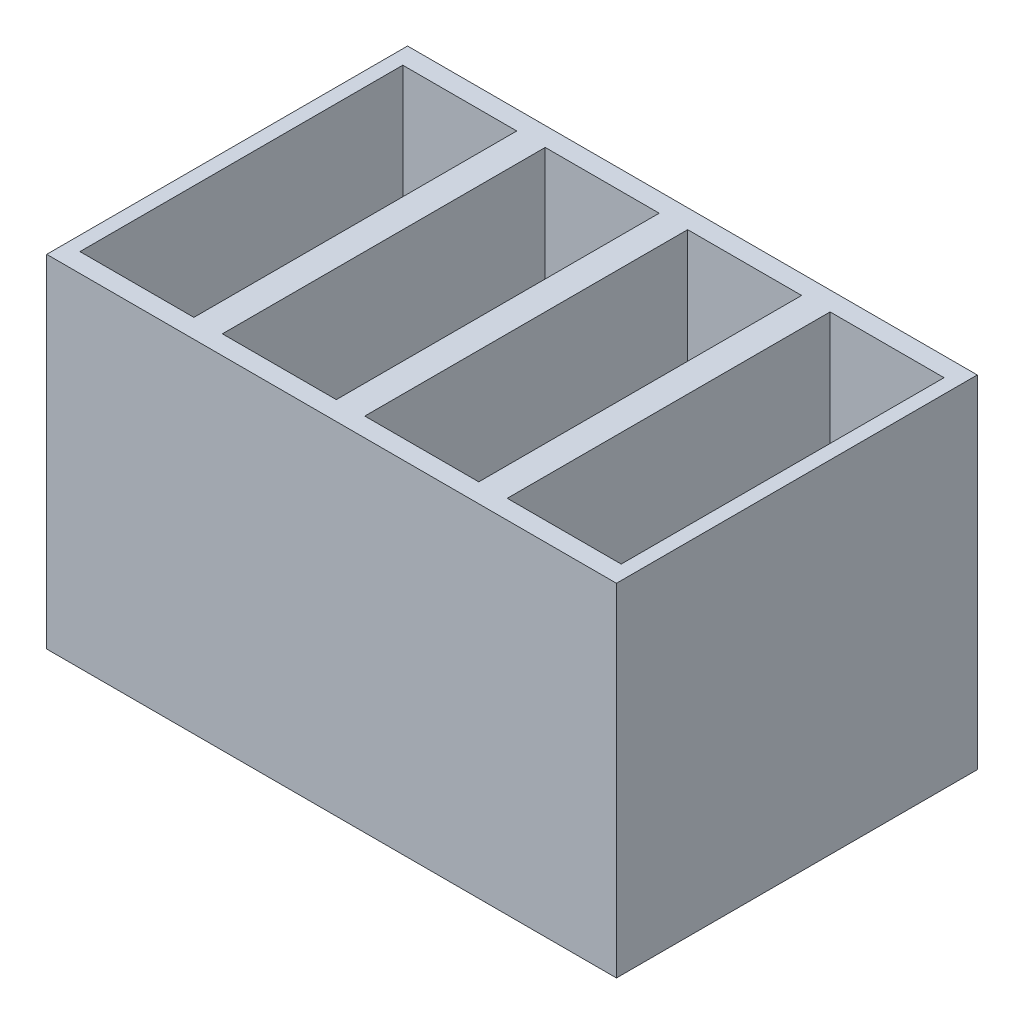
ISO-10303-21;
HEADER;
FILE_DESCRIPTION(('STEP AP214'),'2;1');
FILE_NAME('part.step','',(''),(''),'','','');
FILE_SCHEMA(('AUTOMOTIVE_DESIGN { 1 0 10303 214 1 1 1 1 }'));
ENDSEC;
DATA;
#1=APPLICATION_CONTEXT('core data for automotive mechanical design processes');
#2=APPLICATION_PROTOCOL_DEFINITION('international standard','automotive_design',2000,#1);
#3=PRODUCT_CONTEXT('',#1,'mechanical');
#4=PRODUCT('Part','Part','',(#3));
#5=PRODUCT_RELATED_PRODUCT_CATEGORY('part','',(#4));
#6=PRODUCT_DEFINITION_FORMATION('','',#4);
#7=PRODUCT_DEFINITION_CONTEXT('part definition',#1,'design');
#8=PRODUCT_DEFINITION('design','',#6,#7);
#9=PRODUCT_DEFINITION_SHAPE('','',#8);
#10=(LENGTH_UNIT() NAMED_UNIT(*) SI_UNIT(.MILLI.,.METRE.));
#11=(NAMED_UNIT(*) PLANE_ANGLE_UNIT() SI_UNIT($,.RADIAN.));
#12=(NAMED_UNIT(*) SI_UNIT($,.STERADIAN.) SOLID_ANGLE_UNIT());
#13=UNCERTAINTY_MEASURE_WITH_UNIT(LENGTH_MEASURE(1.E-05),#10,'distance_accuracy_value','');
#14=(GEOMETRIC_REPRESENTATION_CONTEXT(3) GLOBAL_UNCERTAINTY_ASSIGNED_CONTEXT((#13)) GLOBAL_UNIT_ASSIGNED_CONTEXT((#10,
#11,#12)) REPRESENTATION_CONTEXT('',''));
#15=CARTESIAN_POINT('',(0.,0.,0.));
#16=DIRECTION('',(0.,0.,1.));
#17=DIRECTION('',(1.,0.,0.));
#18=AXIS2_PLACEMENT_3D('',#15,#16,#17);
#19=CARTESIAN_POINT('',(0.,914.4,0.));
#20=DIRECTION('',(0.,1.,0.));
#21=DIRECTION('',(0.,0.,0.999999999999999));
#22=AXIS2_PLACEMENT_3D('',#19,#20,#21);
#23=PLANE('',#22);
#24=DIRECTION('',(0.,0.,0.999999999999999));
#25=VECTOR('',#24,1.);
#26=CARTESIAN_POINT('',(-1828.8,914.4,-482.600000000002));
#27=LINE('',#26,#25);
#28=CARTESIAN_POINT('',(-1828.8,914.4,-482.600000000002));
#29=VERTEX_POINT('',#28);
#30=CARTESIAN_POINT('',(-1828.8,914.4,482.599999999998));
#31=VERTEX_POINT('',#30);
#32=EDGE_CURVE('E350',#29,#31,#27,.T.);
#33=ORIENTED_EDGE('',*,*,#32,.T.);
#34=DIRECTION('',(1.,0.,0.));
#35=VECTOR('',#34,1.);
#36=CARTESIAN_POINT('',(-1828.8,914.4,482.599999999998));
#37=LINE('',#36,#35);
#38=CARTESIAN_POINT('',(-304.8,914.4,482.599999999998));
#39=VERTEX_POINT('',#38);
#40=EDGE_CURVE('E354',#31,#39,#37,.T.);
#41=ORIENTED_EDGE('',*,*,#40,.T.);
#42=DIRECTION('',(0.,0.,-0.999999999999999));
#43=VECTOR('',#42,1.);
#44=CARTESIAN_POINT('',(-304.8,914.4,-482.600000000002));
#45=LINE('',#44,#43);
#46=CARTESIAN_POINT('',(-304.8,914.4,-482.600000000002));
#47=VERTEX_POINT('',#46);
#48=EDGE_CURVE('E358',#39,#47,#45,.T.);
#49=ORIENTED_EDGE('',*,*,#48,.T.);
#50=DIRECTION('',(-1.,0.,0.));
#51=VECTOR('',#50,1.);
#52=CARTESIAN_POINT('',(-1828.8,914.4,-482.600000000002));
#53=LINE('',#52,#51);
#54=EDGE_CURVE('E361',#47,#29,#53,.T.);
#55=ORIENTED_EDGE('',*,*,#54,.T.);
#56=EDGE_LOOP('',(#33,#41,#49,#55));
#57=FACE_BOUND('',#56,.T.);
#58=DIRECTION('',(1.,0.,0.));
#59=VECTOR('',#58,1.);
#60=CARTESIAN_POINT('',(-1790.7,914.4,431.799999999999));
#61=LINE('',#60,#59);
#62=CARTESIAN_POINT('',(-1790.7,914.4,431.799999999999));
#63=VERTEX_POINT('',#62);
#64=CARTESIAN_POINT('',(-1485.9,914.4,431.799999999999));
#65=VERTEX_POINT('',#64);
#66=EDGE_CURVE('E310',#63,#65,#61,.T.);
#67=ORIENTED_EDGE('',*,*,#66,.F.);
#68=DIRECTION('',(0.,0.,0.999999999999999));
#69=VECTOR('',#68,1.);
#70=CARTESIAN_POINT('',(-1790.7,914.4,-431.799999999999));
#71=LINE('',#70,#69);
#72=CARTESIAN_POINT('',(-1790.7,914.4,-431.799999999999));
#73=VERTEX_POINT('',#72);
#74=EDGE_CURVE('E307',#73,#63,#71,.T.);
#75=ORIENTED_EDGE('',*,*,#74,.F.);
#76=DIRECTION('',(-1.,0.,0.));
#77=VECTOR('',#76,1.);
#78=CARTESIAN_POINT('',(-1790.7,914.4,-431.799999999999));
#79=LINE('',#78,#77);
#80=CARTESIAN_POINT('',(-1485.9,914.4,-431.799999999999));
#81=VERTEX_POINT('',#80);
#82=EDGE_CURVE('E318',#81,#73,#79,.T.);
#83=ORIENTED_EDGE('',*,*,#82,.F.);
#84=DIRECTION('',(0.,0.,-0.999999999999999));
#85=VECTOR('',#84,1.);
#86=CARTESIAN_POINT('',(-1485.9,914.4,-431.799999999999));
#87=LINE('',#86,#85);
#88=EDGE_CURVE('E314',#65,#81,#87,.T.);
#89=ORIENTED_EDGE('',*,*,#88,.F.);
#90=EDGE_LOOP('',(#67,#75,#83,#89));
#91=FACE_BOUND('',#90,.T.);
#92=DIRECTION('',(0.,0.,0.999999999999999));
#93=VECTOR('',#92,1.);
#94=CARTESIAN_POINT('',(-1409.7,914.4,-431.799999999999));
#95=LINE('',#94,#93);
#96=CARTESIAN_POINT('',(-1409.7,914.4,-431.799999999999));
#97=VERTEX_POINT('',#96);
#98=CARTESIAN_POINT('',(-1409.7,914.4,431.799999999999));
#99=VERTEX_POINT('',#98);
#100=EDGE_CURVE('E267',#97,#99,#95,.T.);
#101=ORIENTED_EDGE('',*,*,#100,.F.);
#102=DIRECTION('',(-1.,0.,0.));
#103=VECTOR('',#102,1.);
#104=CARTESIAN_POINT('',(-1409.7,914.4,-431.799999999999));
#105=LINE('',#104,#103);
#106=CARTESIAN_POINT('',(-1104.9,914.4,-431.799999999999));
#107=VERTEX_POINT('',#106);
#108=EDGE_CURVE('E264',#107,#97,#105,.T.);
#109=ORIENTED_EDGE('',*,*,#108,.F.);
#110=DIRECTION('',(0.,0.,-0.999999999999999));
#111=VECTOR('',#110,1.);
#112=CARTESIAN_POINT('',(-1104.9,914.4,-431.799999999999));
#113=LINE('',#112,#111);
#114=CARTESIAN_POINT('',(-1104.9,914.4,431.799999999999));
#115=VERTEX_POINT('',#114);
#116=EDGE_CURVE('E275',#115,#107,#113,.T.);
#117=ORIENTED_EDGE('',*,*,#116,.F.);
#118=DIRECTION('',(1.,0.,0.));
#119=VECTOR('',#118,1.);
#120=CARTESIAN_POINT('',(-1409.7,914.4,431.799999999999));
#121=LINE('',#120,#119);
#122=EDGE_CURVE('E271',#99,#115,#121,.T.);
#123=ORIENTED_EDGE('',*,*,#122,.F.);
#124=EDGE_LOOP('',(#101,#109,#117,#123));
#125=FACE_BOUND('',#124,.T.);
#126=DIRECTION('',(0.,0.,0.999999999999999));
#127=VECTOR('',#126,1.);
#128=CARTESIAN_POINT('',(-1028.7,914.4,-431.799999999999));
#129=LINE('',#128,#127);
#130=CARTESIAN_POINT('',(-1028.7,914.4,-431.799999999999));
#131=VERTEX_POINT('',#130);
#132=CARTESIAN_POINT('',(-1028.7,914.4,431.799999999999));
#133=VERTEX_POINT('',#132);
#134=EDGE_CURVE('E224',#131,#133,#129,.T.);
#135=ORIENTED_EDGE('',*,*,#134,.F.);
#136=DIRECTION('',(-1.,0.,0.));
#137=VECTOR('',#136,1.);
#138=CARTESIAN_POINT('',(-1028.7,914.4,-431.799999999999));
#139=LINE('',#138,#137);
#140=CARTESIAN_POINT('',(-723.9,914.4,-431.799999999999));
#141=VERTEX_POINT('',#140);
#142=EDGE_CURVE('E221',#141,#131,#139,.T.);
#143=ORIENTED_EDGE('',*,*,#142,.F.);
#144=DIRECTION('',(0.,0.,-0.999999999999999));
#145=VECTOR('',#144,1.);
#146=CARTESIAN_POINT('',(-723.9,914.4,-431.799999999999));
#147=LINE('',#146,#145);
#148=CARTESIAN_POINT('',(-723.9,914.4,431.799999999999));
#149=VERTEX_POINT('',#148);
#150=EDGE_CURVE('E232',#149,#141,#147,.T.);
#151=ORIENTED_EDGE('',*,*,#150,.F.);
#152=DIRECTION('',(1.,0.,0.));
#153=VECTOR('',#152,1.);
#154=CARTESIAN_POINT('',(-1028.7,914.4,431.799999999999));
#155=LINE('',#154,#153);
#156=EDGE_CURVE('E228',#133,#149,#155,.T.);
#157=ORIENTED_EDGE('',*,*,#156,.F.);
#158=EDGE_LOOP('',(#135,#143,#151,#157));
#159=FACE_BOUND('',#158,.T.);
#160=DIRECTION('',(0.,0.,0.999999999999999));
#161=VECTOR('',#160,1.);
#162=CARTESIAN_POINT('',(-647.7,914.4,-431.799999999999));
#163=LINE('',#162,#161);
#164=CARTESIAN_POINT('',(-647.7,914.4,-431.799999999999));
#165=VERTEX_POINT('',#164);
#166=CARTESIAN_POINT('',(-647.7,914.4,431.799999999999));
#167=VERTEX_POINT('',#166);
#168=EDGE_CURVE('E181',#165,#167,#163,.T.);
#169=ORIENTED_EDGE('',*,*,#168,.F.);
#170=DIRECTION('',(-1.,0.,0.));
#171=VECTOR('',#170,1.);
#172=CARTESIAN_POINT('',(-647.7,914.4,-431.799999999999));
#173=LINE('',#172,#171);
#174=CARTESIAN_POINT('',(-342.9,914.4,-431.799999999999));
#175=VERTEX_POINT('',#174);
#176=EDGE_CURVE('E172',#175,#165,#173,.T.);
#177=ORIENTED_EDGE('',*,*,#176,.F.);
#178=DIRECTION('',(0.,0.,-0.999999999999999));
#179=VECTOR('',#178,1.);
#180=CARTESIAN_POINT('',(-342.9,914.4,-431.799999999999));
#181=LINE('',#180,#179);
#182=CARTESIAN_POINT('',(-342.9,914.4,431.799999999999));
#183=VERTEX_POINT('',#182);
#184=EDGE_CURVE('E199',#183,#175,#181,.T.);
#185=ORIENTED_EDGE('',*,*,#184,.F.);
#186=DIRECTION('',(1.,0.,0.));
#187=VECTOR('',#186,1.);
#188=CARTESIAN_POINT('',(-647.7,914.4,431.799999999999));
#189=LINE('',#188,#187);
#190=EDGE_CURVE('E194',#167,#183,#189,.T.);
#191=ORIENTED_EDGE('',*,*,#190,.F.);
#192=EDGE_LOOP('',(#169,#177,#185,#191));
#193=FACE_BOUND('',#192,.T.);
#194=ADVANCED_FACE('F34',(#57,#91,#125,#159,#193),#23,.T.);
#195=CARTESIAN_POINT('',(0.,0.,0.));
#196=DIRECTION('',(0.,1.,0.));
#197=DIRECTION('',(0.,0.,0.999999999999999));
#198=AXIS2_PLACEMENT_3D('',#195,#196,#197);
#199=PLANE('',#198);
#200=DIRECTION('',(-1.,0.,0.));
#201=VECTOR('',#200,1.);
#202=CARTESIAN_POINT('',(-1028.7,2.11626714000298E-13,-431.799999999999));
#203=LINE('',#202,#201);
#204=CARTESIAN_POINT('',(-723.9,2.0611685626562E-13,-431.799999999999));
#205=VERTEX_POINT('',#204);
#206=CARTESIAN_POINT('',(-1028.7,2.11626714000298E-13,-431.799999999999));
#207=VERTEX_POINT('',#206);
#208=EDGE_CURVE('E190',#205,#207,#203,.T.);
#209=ORIENTED_EDGE('',*,*,#208,.T.);
#210=DIRECTION('',(0.,0.,0.999999999999999));
#211=VECTOR('',#210,1.);
#212=CARTESIAN_POINT('',(-1028.7,2.11626714000298E-13,-431.799999999999));
#213=LINE('',#212,#211);
#214=CARTESIAN_POINT('',(-1028.7,-1.74435174291221E-13,431.799999999999));
#215=VERTEX_POINT('',#214);
#216=EDGE_CURVE('E239',#207,#215,#213,.T.);
#217=ORIENTED_EDGE('',*,*,#216,.T.);
#218=DIRECTION('',(1.,0.,0.));
#219=VECTOR('',#218,1.);
#220=CARTESIAN_POINT('',(-1028.7,-1.74435174291221E-13,431.799999999999));
#221=LINE('',#220,#219);
#222=CARTESIAN_POINT('',(-723.9,-1.79945032025899E-13,431.799999999999));
#223=VERTEX_POINT('',#222);
#224=EDGE_CURVE('E243',#215,#223,#221,.T.);
#225=ORIENTED_EDGE('',*,*,#224,.T.);
#226=DIRECTION('',(0.,0.,-0.999999999999999));
#227=VECTOR('',#226,1.);
#228=CARTESIAN_POINT('',(-723.9,2.0611685626562E-13,-431.799999999999));
#229=LINE('',#228,#227);
#230=EDGE_CURVE('E225',#223,#205,#229,.T.);
#231=ORIENTED_EDGE('',*,*,#230,.T.);
#232=EDGE_LOOP('',(#209,#217,#225,#231));
#233=FACE_BOUND('',#232,.T.);
#234=DIRECTION('',(0.,0.,0.999999999999999));
#235=VECTOR('',#234,1.);
#236=CARTESIAN_POINT('',(-1790.7,2.25401358336993E-13,-431.799999999999));
#237=LINE('',#236,#235);
#238=CARTESIAN_POINT('',(-1790.7,2.25401358336993E-13,-431.799999999999));
#239=VERTEX_POINT('',#238);
#240=CARTESIAN_POINT('',(-1790.7,-1.60660529954526E-13,431.799999999999));
#241=VERTEX_POINT('',#240);
#242=EDGE_CURVE('E306',#239,#241,#237,.T.);
#243=ORIENTED_EDGE('',*,*,#242,.T.);
#244=DIRECTION('',(1.,0.,0.));
#245=VECTOR('',#244,1.);
#246=CARTESIAN_POINT('',(-1790.7,-1.60660529954526E-13,431.799999999999));
#247=LINE('',#246,#245);
#248=CARTESIAN_POINT('',(-1485.9,-1.66170387689204E-13,431.799999999999));
#249=VERTEX_POINT('',#248);
#250=EDGE_CURVE('E325',#241,#249,#247,.T.);
#251=ORIENTED_EDGE('',*,*,#250,.T.);
#252=DIRECTION('',(0.,0.,-0.999999999999999));
#253=VECTOR('',#252,1.);
#254=CARTESIAN_POINT('',(-1485.9,2.19891500602315E-13,-431.799999999999));
#255=LINE('',#254,#253);
#256=CARTESIAN_POINT('',(-1485.9,2.19891500602315E-13,-431.799999999999));
#257=VERTEX_POINT('',#256);
#258=EDGE_CURVE('E329',#249,#257,#255,.T.);
#259=ORIENTED_EDGE('',*,*,#258,.T.);
#260=DIRECTION('',(-1.,0.,0.));
#261=VECTOR('',#260,1.);
#262=CARTESIAN_POINT('',(-1790.7,2.25401358336993E-13,-431.799999999999));
#263=LINE('',#262,#261);
#264=EDGE_CURVE('E311',#257,#239,#263,.T.);
#265=ORIENTED_EDGE('',*,*,#264,.T.);
#266=EDGE_LOOP('',(#243,#251,#259,#265));
#267=FACE_BOUND('',#266,.T.);
#268=DIRECTION('',(0.,0.,0.999999999999999));
#269=VECTOR('',#268,1.);
#270=CARTESIAN_POINT('',(-1828.8,2.48799613394506E-13,-482.600000000002));
#271=LINE('',#270,#269);
#272=CARTESIAN_POINT('',(-1828.8,2.48799613394506E-13,-482.600000000002));
#273=VERTEX_POINT('',#272);
#274=CARTESIAN_POINT('',(-1828.8,-1.8268132057837E-13,482.600000000002));
#275=VERTEX_POINT('',#274);
#276=EDGE_CURVE('E349',#273,#275,#271,.T.);
#277=ORIENTED_EDGE('',*,*,#276,.F.);
#278=DIRECTION('',(-1.,0.,0.));
#279=VECTOR('',#278,1.);
#280=CARTESIAN_POINT('',(-1828.8,2.48799613394506E-13,-482.600000000002));
#281=LINE('',#280,#279);
#282=CARTESIAN_POINT('',(-304.8,2.21250324721116E-13,-482.600000000002));
#283=VERTEX_POINT('',#282);
#284=EDGE_CURVE('E355',#283,#273,#281,.T.);
#285=ORIENTED_EDGE('',*,*,#284,.F.);
#286=DIRECTION('',(0.,0.,-0.999999999999999));
#287=VECTOR('',#286,1.);
#288=CARTESIAN_POINT('',(-304.8,2.21250324721116E-13,-482.600000000002));
#289=LINE('',#288,#287);
#290=CARTESIAN_POINT('',(-304.8,-2.10230609251759E-13,482.599999999998));
#291=VERTEX_POINT('',#290);
#292=EDGE_CURVE('E371',#291,#283,#289,.T.);
#293=ORIENTED_EDGE('',*,*,#292,.F.);
#294=DIRECTION('',(1.,0.,0.));
#295=VECTOR('',#294,1.);
#296=CARTESIAN_POINT('',(-1828.8,-1.8268132057837E-13,482.600000000002));
#297=LINE('',#296,#295);
#298=EDGE_CURVE('E368',#275,#291,#297,.T.);
#299=ORIENTED_EDGE('',*,*,#298,.F.);
#300=EDGE_LOOP('',(#277,#285,#293,#299));
#301=FACE_BOUND('',#300,.T.);
#302=DIRECTION('',(-1.,0.,0.));
#303=VECTOR('',#302,1.);
#304=CARTESIAN_POINT('',(-1409.7,2.18514036168645E-13,-431.799999999999));
#305=LINE('',#304,#303);
#306=CARTESIAN_POINT('',(-1104.9,2.13004178433967E-13,-431.799999999999));
#307=VERTEX_POINT('',#306);
#308=CARTESIAN_POINT('',(-1409.7,2.18514036168645E-13,-431.799999999999));
#309=VERTEX_POINT('',#308);
#310=EDGE_CURVE('E263',#307,#309,#305,.T.);
#311=ORIENTED_EDGE('',*,*,#310,.T.);
#312=DIRECTION('',(0.,0.,0.999999999999999));
#313=VECTOR('',#312,1.);
#314=CARTESIAN_POINT('',(-1409.7,2.18514036168645E-13,-431.799999999999));
#315=LINE('',#314,#313);
#316=CARTESIAN_POINT('',(-1409.7,-1.67547852122874E-13,431.799999999999));
#317=VERTEX_POINT('',#316);
#318=EDGE_CURVE('E282',#309,#317,#315,.T.);
#319=ORIENTED_EDGE('',*,*,#318,.T.);
#320=DIRECTION('',(1.,0.,0.));
#321=VECTOR('',#320,1.);
#322=CARTESIAN_POINT('',(-1409.7,-1.67547852122874E-13,431.799999999999));
#323=LINE('',#322,#321);
#324=CARTESIAN_POINT('',(-1104.9,-1.73057709857552E-13,431.799999999999));
#325=VERTEX_POINT('',#324);
#326=EDGE_CURVE('E286',#317,#325,#323,.T.);
#327=ORIENTED_EDGE('',*,*,#326,.T.);
#328=DIRECTION('',(0.,0.,-0.999999999999999));
#329=VECTOR('',#328,1.);
#330=CARTESIAN_POINT('',(-1104.9,2.13004178433967E-13,-431.799999999999));
#331=LINE('',#330,#329);
#332=EDGE_CURVE('E268',#325,#307,#331,.T.);
#333=ORIENTED_EDGE('',*,*,#332,.T.);
#334=EDGE_LOOP('',(#311,#319,#327,#333));
#335=FACE_BOUND('',#334,.T.);
#336=DIRECTION('',(-1.,0.,0.));
#337=VECTOR('',#336,1.);
#338=CARTESIAN_POINT('',(-647.7,2.0473939183195E-13,-431.799999999999));
#339=LINE('',#338,#337);
#340=CARTESIAN_POINT('',(-342.9,1.99229534097273E-13,-431.799999999999));
#341=VERTEX_POINT('',#340);
#342=CARTESIAN_POINT('',(-647.7,2.0473939183195E-13,-431.799999999999));
#343=VERTEX_POINT('',#342);
#344=EDGE_CURVE('E58',#341,#343,#339,.T.);
#345=ORIENTED_EDGE('',*,*,#344,.T.);
#346=DIRECTION('',(0.,0.,0.999999999999999));
#347=VECTOR('',#346,1.);
#348=CARTESIAN_POINT('',(-647.7,2.0473939183195E-13,-431.799999999999));
#349=LINE('',#348,#347);
#350=CARTESIAN_POINT('',(-647.7,-1.81322496459569E-13,431.799999999999));
#351=VERTEX_POINT('',#350);
#352=EDGE_CURVE('E188',#343,#351,#349,.T.);
#353=ORIENTED_EDGE('',*,*,#352,.T.);
#354=DIRECTION('',(1.,0.,0.));
#355=VECTOR('',#354,1.);
#356=CARTESIAN_POINT('',(-647.7,-1.81322496459569E-13,431.799999999999));
#357=LINE('',#356,#355);
#358=CARTESIAN_POINT('',(-342.9,-1.86832354194247E-13,431.799999999999));
#359=VERTEX_POINT('',#358);
#360=EDGE_CURVE('E208',#351,#359,#357,.T.);
#361=ORIENTED_EDGE('',*,*,#360,.T.);
#362=DIRECTION('',(0.,0.,-0.999999999999999));
#363=VECTOR('',#362,1.);
#364=CARTESIAN_POINT('',(-342.9,1.99229534097273E-13,-431.799999999999));
#365=LINE('',#364,#363);
#366=EDGE_CURVE('E182',#359,#341,#365,.T.);
#367=ORIENTED_EDGE('',*,*,#366,.T.);
#368=EDGE_LOOP('',(#345,#353,#361,#367));
#369=FACE_BOUND('',#368,.T.);
#370=ADVANCED_FACE('F395',(#233,#267,#301,#335,#369),#199,.F.);
#371=CARTESIAN_POINT('',(-1828.8,914.4,-482.600000000002));
#372=DIRECTION('',(1.,0.,0.));
#373=DIRECTION('',(0.,0.,-0.999999999999999));
#374=AXIS2_PLACEMENT_3D('',#371,#372,#373);
#375=PLANE('',#374);
#376=ORIENTED_EDGE('',*,*,#276,.T.);
#377=DIRECTION('',(0.,-1.,0.));
#378=VECTOR('',#377,1.);
#379=CARTESIAN_POINT('',(-1828.8,914.4,482.599999999998));
#380=LINE('',#379,#378);
#381=EDGE_CURVE('E11',#31,#275,#380,.T.);
#382=ORIENTED_EDGE('',*,*,#381,.F.);
#383=ORIENTED_EDGE('',*,*,#32,.F.);
#384=DIRECTION('',(0.,-1.,0.));
#385=VECTOR('',#384,1.);
#386=CARTESIAN_POINT('',(-1828.8,914.4,-482.600000000002));
#387=LINE('',#386,#385);
#388=EDGE_CURVE('E364',#29,#273,#387,.T.);
#389=ORIENTED_EDGE('',*,*,#388,.T.);
#390=EDGE_LOOP('',(#376,#382,#383,#389));
#391=FACE_BOUND('',#390,.T.);
#392=ADVANCED_FACE('F36',(#391),#375,.F.);
#393=CARTESIAN_POINT('',(-1828.8,914.4,482.599999999998));
#394=DIRECTION('',(0.,0.,-0.999999999999999));
#395=DIRECTION('',(-1.,0.,0.));
#396=AXIS2_PLACEMENT_3D('',#393,#394,#395);
#397=PLANE('',#396);
#398=ORIENTED_EDGE('',*,*,#298,.T.);
#399=DIRECTION('',(0.,-1.,0.));
#400=VECTOR('',#399,1.);
#401=CARTESIAN_POINT('',(-304.8,914.4,482.599999999998));
#402=LINE('',#401,#400);
#403=EDGE_CURVE('E43',#39,#291,#402,.T.);
#404=ORIENTED_EDGE('',*,*,#403,.F.);
#405=ORIENTED_EDGE('',*,*,#40,.F.);
#406=ORIENTED_EDGE('',*,*,#381,.T.);
#407=EDGE_LOOP('',(#398,#404,#405,#406));
#408=FACE_BOUND('',#407,.T.);
#409=ADVANCED_FACE('F406',(#408),#397,.F.);
#410=CARTESIAN_POINT('',(-304.8,914.4,-482.600000000002));
#411=DIRECTION('',(-1.,0.,0.));
#412=DIRECTION('',(0.,0.,0.999999999999999));
#413=AXIS2_PLACEMENT_3D('',#410,#411,#412);
#414=PLANE('',#413);
#415=ORIENTED_EDGE('',*,*,#292,.T.);
#416=DIRECTION('',(0.,-1.,0.));
#417=VECTOR('',#416,1.);
#418=CARTESIAN_POINT('',(-304.8,914.4,-482.600000000002));
#419=LINE('',#418,#417);
#420=EDGE_CURVE('E379',#47,#283,#419,.T.);
#421=ORIENTED_EDGE('',*,*,#420,.F.);
#422=ORIENTED_EDGE('',*,*,#48,.F.);
#423=ORIENTED_EDGE('',*,*,#403,.T.);
#424=EDGE_LOOP('',(#415,#421,#422,#423));
#425=FACE_BOUND('',#424,.T.);
#426=ADVANCED_FACE('F389',(#425),#414,.F.);
#427=CARTESIAN_POINT('',(-1828.8,914.4,-482.600000000002));
#428=DIRECTION('',(0.,0.,0.999999999999999));
#429=DIRECTION('',(1.,0.,0.));
#430=AXIS2_PLACEMENT_3D('',#427,#428,#429);
#431=PLANE('',#430);
#432=ORIENTED_EDGE('',*,*,#284,.T.);
#433=ORIENTED_EDGE('',*,*,#388,.F.);
#434=ORIENTED_EDGE('',*,*,#54,.F.);
#435=ORIENTED_EDGE('',*,*,#420,.T.);
#436=EDGE_LOOP('',(#432,#433,#434,#435));
#437=FACE_BOUND('',#436,.T.);
#438=ADVANCED_FACE('F399',(#437),#431,.F.);
#439=CARTESIAN_POINT('',(-1790.7,914.4,-431.799999999999));
#440=DIRECTION('',(1.,0.,0.));
#441=DIRECTION('',(0.,0.,-0.999999999999999));
#442=AXIS2_PLACEMENT_3D('',#439,#440,#441);
#443=PLANE('',#442);
#444=ORIENTED_EDGE('',*,*,#242,.F.);
#445=DIRECTION('',(0.,-1.,0.));
#446=VECTOR('',#445,1.);
#447=CARTESIAN_POINT('',(-1790.7,914.4,-431.799999999999));
#448=LINE('',#447,#446);
#449=EDGE_CURVE('E321',#73,#239,#448,.T.);
#450=ORIENTED_EDGE('',*,*,#449,.F.);
#451=ORIENTED_EDGE('',*,*,#74,.T.);
#452=DIRECTION('',(0.,-1.,0.));
#453=VECTOR('',#452,1.);
#454=CARTESIAN_POINT('',(-1790.7,914.4,431.799999999999));
#455=LINE('',#454,#453);
#456=EDGE_CURVE('E345',#63,#241,#455,.T.);
#457=ORIENTED_EDGE('',*,*,#456,.T.);
#458=EDGE_LOOP('',(#444,#450,#451,#457));
#459=FACE_BOUND('',#458,.T.);
#460=ADVANCED_FACE('F421',(#459),#443,.T.);
#461=CARTESIAN_POINT('',(-1790.7,914.4,431.799999999999));
#462=DIRECTION('',(0.,0.,-0.999999999999999));
#463=DIRECTION('',(-1.,0.,0.));
#464=AXIS2_PLACEMENT_3D('',#461,#462,#463);
#465=PLANE('',#464);
#466=ORIENTED_EDGE('',*,*,#250,.F.);
#467=ORIENTED_EDGE('',*,*,#456,.F.);
#468=ORIENTED_EDGE('',*,*,#66,.T.);
#469=DIRECTION('',(0.,-1.,0.));
#470=VECTOR('',#469,1.);
#471=CARTESIAN_POINT('',(-1485.9,914.4,431.799999999999));
#472=LINE('',#471,#470);
#473=EDGE_CURVE('E342',#65,#249,#472,.T.);
#474=ORIENTED_EDGE('',*,*,#473,.T.);
#475=EDGE_LOOP('',(#466,#467,#468,#474));
#476=FACE_BOUND('',#475,.T.);
#477=ADVANCED_FACE('F428',(#476),#465,.T.);
#478=CARTESIAN_POINT('',(-1485.9,914.4,-431.799999999999));
#479=DIRECTION('',(-1.,0.,0.));
#480=DIRECTION('',(0.,0.,0.999999999999999));
#481=AXIS2_PLACEMENT_3D('',#478,#479,#480);
#482=PLANE('',#481);
#483=ORIENTED_EDGE('',*,*,#258,.F.);
#484=ORIENTED_EDGE('',*,*,#473,.F.);
#485=ORIENTED_EDGE('',*,*,#88,.T.);
#486=DIRECTION('',(0.,-1.,0.));
#487=VECTOR('',#486,1.);
#488=CARTESIAN_POINT('',(-1485.9,914.4,-431.799999999999));
#489=LINE('',#488,#487);
#490=EDGE_CURVE('E339',#81,#257,#489,.T.);
#491=ORIENTED_EDGE('',*,*,#490,.T.);
#492=EDGE_LOOP('',(#483,#484,#485,#491));
#493=FACE_BOUND('',#492,.T.);
#494=ADVANCED_FACE('F433',(#493),#482,.T.);
#495=CARTESIAN_POINT('',(-1790.7,914.4,-431.799999999999));
#496=DIRECTION('',(0.,0.,0.999999999999999));
#497=DIRECTION('',(1.,0.,0.));
#498=AXIS2_PLACEMENT_3D('',#495,#496,#497);
#499=PLANE('',#498);
#500=ORIENTED_EDGE('',*,*,#264,.F.);
#501=ORIENTED_EDGE('',*,*,#490,.F.);
#502=ORIENTED_EDGE('',*,*,#82,.T.);
#503=ORIENTED_EDGE('',*,*,#449,.T.);
#504=EDGE_LOOP('',(#500,#501,#502,#503));
#505=FACE_BOUND('',#504,.T.);
#506=ADVANCED_FACE('F441',(#505),#499,.T.);
#507=CARTESIAN_POINT('',(-1409.7,914.4,-431.799999999999));
#508=DIRECTION('',(0.,0.,0.999999999999999));
#509=DIRECTION('',(1.,0.,0.));
#510=AXIS2_PLACEMENT_3D('',#507,#508,#509);
#511=PLANE('',#510);
#512=ORIENTED_EDGE('',*,*,#310,.F.);
#513=DIRECTION('',(0.,-1.,0.));
#514=VECTOR('',#513,1.);
#515=CARTESIAN_POINT('',(-1104.9,914.4,-431.799999999999));
#516=LINE('',#515,#514);
#517=EDGE_CURVE('E278',#107,#307,#516,.T.);
#518=ORIENTED_EDGE('',*,*,#517,.F.);
#519=ORIENTED_EDGE('',*,*,#108,.T.);
#520=DIRECTION('',(0.,-1.,0.));
#521=VECTOR('',#520,1.);
#522=CARTESIAN_POINT('',(-1409.7,914.4,-431.799999999999));
#523=LINE('',#522,#521);
#524=EDGE_CURVE('E302',#97,#309,#523,.T.);
#525=ORIENTED_EDGE('',*,*,#524,.T.);
#526=EDGE_LOOP('',(#512,#518,#519,#525));
#527=FACE_BOUND('',#526,.T.);
#528=ADVANCED_FACE('F495',(#527),#511,.T.);
#529=CARTESIAN_POINT('',(-1409.7,914.4,-431.799999999999));
#530=DIRECTION('',(1.,0.,0.));
#531=DIRECTION('',(0.,0.,-0.999999999999999));
#532=AXIS2_PLACEMENT_3D('',#529,#530,#531);
#533=PLANE('',#532);
#534=ORIENTED_EDGE('',*,*,#318,.F.);
#535=ORIENTED_EDGE('',*,*,#524,.F.);
#536=ORIENTED_EDGE('',*,*,#100,.T.);
#537=DIRECTION('',(0.,-1.,0.));
#538=VECTOR('',#537,1.);
#539=CARTESIAN_POINT('',(-1409.7,914.4,431.799999999999));
#540=LINE('',#539,#538);
#541=EDGE_CURVE('E299',#99,#317,#540,.T.);
#542=ORIENTED_EDGE('',*,*,#541,.T.);
#543=EDGE_LOOP('',(#534,#535,#536,#542));
#544=FACE_BOUND('',#543,.T.);
#545=ADVANCED_FACE('F491',(#544),#533,.T.);
#546=CARTESIAN_POINT('',(-1409.7,914.4,431.799999999999));
#547=DIRECTION('',(0.,0.,-0.999999999999999));
#548=DIRECTION('',(-1.,0.,0.));
#549=AXIS2_PLACEMENT_3D('',#546,#547,#548);
#550=PLANE('',#549);
#551=ORIENTED_EDGE('',*,*,#326,.F.);
#552=ORIENTED_EDGE('',*,*,#541,.F.);
#553=ORIENTED_EDGE('',*,*,#122,.T.);
#554=DIRECTION('',(0.,-1.,0.));
#555=VECTOR('',#554,1.);
#556=CARTESIAN_POINT('',(-1104.9,914.4,431.799999999999));
#557=LINE('',#556,#555);
#558=EDGE_CURVE('E296',#115,#325,#557,.T.);
#559=ORIENTED_EDGE('',*,*,#558,.T.);
#560=EDGE_LOOP('',(#551,#552,#553,#559));
#561=FACE_BOUND('',#560,.T.);
#562=ADVANCED_FACE('F487',(#561),#550,.T.);
#563=CARTESIAN_POINT('',(-1104.9,914.4,-431.799999999999));
#564=DIRECTION('',(-1.,0.,0.));
#565=DIRECTION('',(0.,0.,0.999999999999999));
#566=AXIS2_PLACEMENT_3D('',#563,#564,#565);
#567=PLANE('',#566);
#568=ORIENTED_EDGE('',*,*,#332,.F.);
#569=ORIENTED_EDGE('',*,*,#558,.F.);
#570=ORIENTED_EDGE('',*,*,#116,.T.);
#571=ORIENTED_EDGE('',*,*,#517,.T.);
#572=EDGE_LOOP('',(#568,#569,#570,#571));
#573=FACE_BOUND('',#572,.T.);
#574=ADVANCED_FACE('F484',(#573),#567,.T.);
#575=CARTESIAN_POINT('',(-1028.7,914.4,-431.799999999999));
#576=DIRECTION('',(0.,0.,0.999999999999999));
#577=DIRECTION('',(1.,0.,0.));
#578=AXIS2_PLACEMENT_3D('',#575,#576,#577);
#579=PLANE('',#578);
#580=ORIENTED_EDGE('',*,*,#208,.F.);
#581=DIRECTION('',(0.,-1.,0.));
#582=VECTOR('',#581,1.);
#583=CARTESIAN_POINT('',(-723.9,914.4,-431.799999999999));
#584=LINE('',#583,#582);
#585=EDGE_CURVE('E235',#141,#205,#584,.T.);
#586=ORIENTED_EDGE('',*,*,#585,.F.);
#587=ORIENTED_EDGE('',*,*,#142,.T.);
#588=DIRECTION('',(0.,-1.,0.));
#589=VECTOR('',#588,1.);
#590=CARTESIAN_POINT('',(-1028.7,914.4,-431.799999999999));
#591=LINE('',#590,#589);
#592=EDGE_CURVE('E259',#131,#207,#591,.T.);
#593=ORIENTED_EDGE('',*,*,#592,.T.);
#594=EDGE_LOOP('',(#580,#586,#587,#593));
#595=FACE_BOUND('',#594,.T.);
#596=ADVANCED_FACE('F466',(#595),#579,.T.);
#597=CARTESIAN_POINT('',(-1028.7,914.4,-431.799999999999));
#598=DIRECTION('',(1.,0.,0.));
#599=DIRECTION('',(0.,0.,-0.999999999999999));
#600=AXIS2_PLACEMENT_3D('',#597,#598,#599);
#601=PLANE('',#600);
#602=ORIENTED_EDGE('',*,*,#216,.F.);
#603=ORIENTED_EDGE('',*,*,#592,.F.);
#604=ORIENTED_EDGE('',*,*,#134,.T.);
#605=DIRECTION('',(0.,-1.,0.));
#606=VECTOR('',#605,1.);
#607=CARTESIAN_POINT('',(-1028.7,914.4,431.799999999999));
#608=LINE('',#607,#606);
#609=EDGE_CURVE('E256',#133,#215,#608,.T.);
#610=ORIENTED_EDGE('',*,*,#609,.T.);
#611=EDGE_LOOP('',(#602,#603,#604,#610));
#612=FACE_BOUND('',#611,.T.);
#613=ADVANCED_FACE('F460',(#612),#601,.T.);
#614=CARTESIAN_POINT('',(-1028.7,914.4,431.799999999999));
#615=DIRECTION('',(0.,0.,-0.999999999999999));
#616=DIRECTION('',(-1.,0.,0.));
#617=AXIS2_PLACEMENT_3D('',#614,#615,#616);
#618=PLANE('',#617);
#619=ORIENTED_EDGE('',*,*,#224,.F.);
#620=ORIENTED_EDGE('',*,*,#609,.F.);
#621=ORIENTED_EDGE('',*,*,#156,.T.);
#622=DIRECTION('',(0.,-1.,0.));
#623=VECTOR('',#622,1.);
#624=CARTESIAN_POINT('',(-723.9,914.4,431.799999999999));
#625=LINE('',#624,#623);
#626=EDGE_CURVE('E253',#149,#223,#625,.T.);
#627=ORIENTED_EDGE('',*,*,#626,.T.);
#628=EDGE_LOOP('',(#619,#620,#621,#627));
#629=FACE_BOUND('',#628,.T.);
#630=ADVANCED_FACE('F463',(#629),#618,.T.);
#631=CARTESIAN_POINT('',(-723.9,914.4,-431.799999999999));
#632=DIRECTION('',(-1.,0.,0.));
#633=DIRECTION('',(0.,0.,0.999999999999999));
#634=AXIS2_PLACEMENT_3D('',#631,#632,#633);
#635=PLANE('',#634);
#636=ORIENTED_EDGE('',*,*,#230,.F.);
#637=ORIENTED_EDGE('',*,*,#626,.F.);
#638=ORIENTED_EDGE('',*,*,#150,.T.);
#639=ORIENTED_EDGE('',*,*,#585,.T.);
#640=EDGE_LOOP('',(#636,#637,#638,#639));
#641=FACE_BOUND('',#640,.T.);
#642=ADVANCED_FACE('F469',(#641),#635,.T.);
#643=CARTESIAN_POINT('',(-647.7,914.4,-431.799999999999));
#644=DIRECTION('',(0.,0.,0.999999999999999));
#645=DIRECTION('',(1.,0.,0.));
#646=AXIS2_PLACEMENT_3D('',#643,#644,#645);
#647=PLANE('',#646);
#648=ORIENTED_EDGE('',*,*,#344,.F.);
#649=DIRECTION('',(0.,-1.,0.));
#650=VECTOR('',#649,1.);
#651=CARTESIAN_POINT('',(-342.9,914.4,-431.799999999999));
#652=LINE('',#651,#650);
#653=EDGE_CURVE('E176',#175,#341,#652,.T.);
#654=ORIENTED_EDGE('',*,*,#653,.F.);
#655=ORIENTED_EDGE('',*,*,#176,.T.);
#656=DIRECTION('',(0.,-1.,0.));
#657=VECTOR('',#656,1.);
#658=CARTESIAN_POINT('',(-647.7,914.4,-431.799999999999));
#659=LINE('',#658,#657);
#660=EDGE_CURVE('E175',#165,#343,#659,.T.);
#661=ORIENTED_EDGE('',*,*,#660,.T.);
#662=EDGE_LOOP('',(#648,#654,#655,#661));
#663=FACE_BOUND('',#662,.T.);
#664=ADVANCED_FACE('F174',(#663),#647,.T.);
#665=CARTESIAN_POINT('',(-647.7,914.4,-431.799999999999));
#666=DIRECTION('',(1.,0.,0.));
#667=DIRECTION('',(0.,0.,-0.999999999999999));
#668=AXIS2_PLACEMENT_3D('',#665,#666,#667);
#669=PLANE('',#668);
#670=ORIENTED_EDGE('',*,*,#352,.F.);
#671=ORIENTED_EDGE('',*,*,#660,.F.);
#672=ORIENTED_EDGE('',*,*,#168,.T.);
#673=DIRECTION('',(0.,-1.,0.));
#674=VECTOR('',#673,1.);
#675=CARTESIAN_POINT('',(-647.7,914.4,431.799999999999));
#676=LINE('',#675,#674);
#677=EDGE_CURVE('E191',#167,#351,#676,.T.);
#678=ORIENTED_EDGE('',*,*,#677,.T.);
#679=EDGE_LOOP('',(#670,#671,#672,#678));
#680=FACE_BOUND('',#679,.T.);
#681=ADVANCED_FACE('F185',(#680),#669,.T.);
#682=CARTESIAN_POINT('',(-647.7,914.4,431.799999999999));
#683=DIRECTION('',(0.,0.,-0.999999999999999));
#684=DIRECTION('',(-1.,0.,0.));
#685=AXIS2_PLACEMENT_3D('',#682,#683,#684);
#686=PLANE('',#685);
#687=ORIENTED_EDGE('',*,*,#360,.F.);
#688=ORIENTED_EDGE('',*,*,#677,.F.);
#689=ORIENTED_EDGE('',*,*,#190,.T.);
#690=DIRECTION('',(0.,-1.,0.));
#691=VECTOR('',#690,1.);
#692=CARTESIAN_POINT('',(-342.9,914.4,431.799999999999));
#693=LINE('',#692,#691);
#694=EDGE_CURVE('E50',#183,#359,#693,.T.);
#695=ORIENTED_EDGE('',*,*,#694,.T.);
#696=EDGE_LOOP('',(#687,#688,#689,#695));
#697=FACE_BOUND('',#696,.T.);
#698=ADVANCED_FACE('F558',(#697),#686,.T.);
#699=CARTESIAN_POINT('',(-342.9,914.4,-431.799999999999));
#700=DIRECTION('',(-1.,0.,0.));
#701=DIRECTION('',(0.,0.,0.999999999999999));
#702=AXIS2_PLACEMENT_3D('',#699,#700,#701);
#703=PLANE('',#702);
#704=ORIENTED_EDGE('',*,*,#366,.F.);
#705=ORIENTED_EDGE('',*,*,#694,.F.);
#706=ORIENTED_EDGE('',*,*,#184,.T.);
#707=ORIENTED_EDGE('',*,*,#653,.T.);
#708=EDGE_LOOP('',(#704,#705,#706,#707));
#709=FACE_BOUND('',#708,.T.);
#710=ADVANCED_FACE('F566',(#709),#703,.T.);
#711=CLOSED_SHELL('',(#194,#370,#392,#409,#426,#438,#460,#477,#494,#506,#528,#545,#562,#574,
#596,#613,#630,#642,#664,#681,#698,#710));
#712=MANIFOLD_SOLID_BREP('B2',#711);
#713=ADVANCED_BREP_SHAPE_REPRESENTATION('',(#18,#712),#14);
#714=SHAPE_DEFINITION_REPRESENTATION(#9,#713);
ENDSEC;
END-ISO-10303-21;
